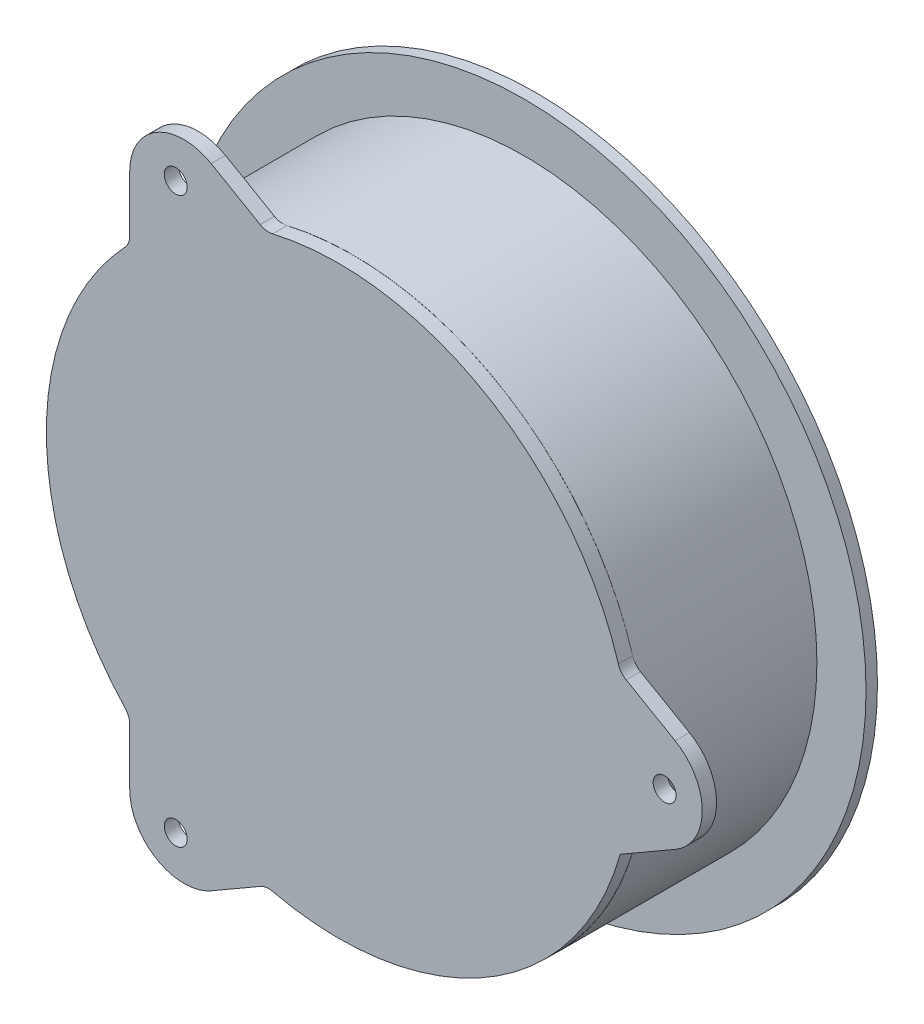
ISO-10303-21;
HEADER;
FILE_DESCRIPTION(('STEP AP214'),'2;1');
FILE_NAME('part.step','',(''),(''),'','','');
FILE_SCHEMA(('AUTOMOTIVE_DESIGN { 1 0 10303 214 1 1 1 1 }'));
ENDSEC;
DATA;
#1=APPLICATION_CONTEXT('core data for automotive mechanical design processes');
#2=APPLICATION_PROTOCOL_DEFINITION('international standard','automotive_design',2000,#1);
#3=PRODUCT_CONTEXT('',#1,'mechanical');
#4=PRODUCT('Part','Part','',(#3));
#5=PRODUCT_RELATED_PRODUCT_CATEGORY('part','',(#4));
#6=PRODUCT_DEFINITION_FORMATION('','',#4);
#7=PRODUCT_DEFINITION_CONTEXT('part definition',#1,'design');
#8=PRODUCT_DEFINITION('design','',#6,#7);
#9=PRODUCT_DEFINITION_SHAPE('','',#8);
#10=(LENGTH_UNIT() NAMED_UNIT(*) SI_UNIT(.MILLI.,.METRE.));
#11=(NAMED_UNIT(*) PLANE_ANGLE_UNIT() SI_UNIT($,.RADIAN.));
#12=(NAMED_UNIT(*) SI_UNIT($,.STERADIAN.) SOLID_ANGLE_UNIT());
#13=UNCERTAINTY_MEASURE_WITH_UNIT(LENGTH_MEASURE(1.E-05),#10,'distance_accuracy_value','');
#14=(GEOMETRIC_REPRESENTATION_CONTEXT(3) GLOBAL_UNCERTAINTY_ASSIGNED_CONTEXT((#13)) GLOBAL_UNIT_ASSIGNED_CONTEXT((#10,
#11,#12)) REPRESENTATION_CONTEXT('',''));
#15=CARTESIAN_POINT('',(0.,0.,0.));
#16=DIRECTION('',(0.,0.,1.));
#17=DIRECTION('',(1.,0.,0.));
#18=AXIS2_PLACEMENT_3D('',#15,#16,#17);
#19=CARTESIAN_POINT('',(0.,0.,81.28));
#20=DIRECTION('',(0.,0.,1.));
#21=DIRECTION('',(1.,0.,0.));
#22=AXIS2_PLACEMENT_3D('',#19,#20,#21);
#23=PLANE('',#22);
#24=CARTESIAN_POINT('',(-100.489363805133,-93.9319833695154,81.28));
#25=DIRECTION('',(0.,0.,-1.));
#26=DIRECTION('',(-1.,0.,0.));
#27=AXIS2_PLACEMENT_3D('',#24,#25,#26);
#28=CIRCLE('',#27,7.62000000000001);
#29=CARTESIAN_POINT('',(-94.9226455523167,-88.728518380322,81.28));
#30=VERTEX_POINT('',#29);
#31=CARTESIAN_POINT('',(-94.3081144996637,-89.4759136860797,81.28));
#32=VERTEX_POINT('',#31);
#33=EDGE_CURVE('E51',#30,#32,#28,.T.);
#34=ORIENTED_EDGE('',*,*,#33,.F.);
#35=CARTESIAN_POINT('',(0.,0.,81.28));
#36=DIRECTION('',(0.,0.,1.));
#37=DIRECTION('',(1.,0.,0.));
#38=AXIS2_PLACEMENT_3D('',#35,#36,#37);
#39=CIRCLE('',#38,129.934824479883);
#40=CARTESIAN_POINT('',(-94.9226455523159,88.7285183803229,81.28));
#41=VERTEX_POINT('',#40);
#42=EDGE_CURVE('E55',#41,#30,#39,.T.);
#43=ORIENTED_EDGE('',*,*,#42,.F.);
#44=CARTESIAN_POINT('',(-100.489363805132,93.9319833695163,81.28));
#45=DIRECTION('',(0.,0.,-1.));
#46=DIRECTION('',(1.,0.,0.));
#47=AXIS2_PLACEMENT_3D('',#44,#45,#46);
#48=CIRCLE('',#47,7.62);
#49=CARTESIAN_POINT('',(-94.3081144996605,89.4759136860832,81.28));
#50=VERTEX_POINT('',#49);
#51=EDGE_CURVE('E11',#50,#41,#48,.T.);
#52=ORIENTED_EDGE('',*,*,#51,.F.);
#53=CARTESIAN_POINT('',(0.,0.,81.28));
#54=DIRECTION('',(0.,0.,1.));
#55=DIRECTION('',(1.,0.,0.));
#56=AXIS2_PLACEMENT_3D('',#53,#54,#55);
#57=CIRCLE('',#56,129.999844578524);
#58=EDGE_CURVE('E717',#50,#32,#57,.T.);
#59=ORIENTED_EDGE('',*,*,#58,.T.);
#60=EDGE_LOOP('',(#34,#43,#52,#59));
#61=FACE_BOUND('',#60,.T.);
#62=ADVANCED_FACE('F33',(#61),#23,.T.);
#63=CARTESIAN_POINT('',(-31.1028019232913,133.992333550139,81.28));
#64=DIRECTION('',(0.,0.,-1.));
#65=DIRECTION('',(-1.,0.,0.));
#66=AXIS2_PLACEMENT_3D('',#63,#64,#65);
#67=CIRCLE('',#66,7.61999999999998);
#68=CARTESIAN_POINT('',(-29.3798281813551,126.569681632893,81.28));
#69=VERTEX_POINT('',#68);
#70=CARTESIAN_POINT('',(-30.334357029137,126.41117978276,81.28));
#71=VERTEX_POINT('',#70);
#72=EDGE_CURVE('E588',#69,#71,#67,.T.);
#73=ORIENTED_EDGE('',*,*,#72,.F.);
#74=CARTESIAN_POINT('',(0.,0.,81.28));
#75=DIRECTION('',(0.,0.,1.));
#76=DIRECTION('',(1.,0.,0.));
#77=AXIS2_PLACEMENT_3D('',#74,#75,#76);
#78=CIRCLE('',#77,129.934824479883);
#79=CARTESIAN_POINT('',(124.302473733672,37.8411632525701,81.28));
#80=VERTEX_POINT('',#79);
#81=EDGE_CURVE('E589',#80,#69,#78,.T.);
#82=ORIENTED_EDGE('',*,*,#81,.F.);
#83=CARTESIAN_POINT('',(131.592165728425,40.0603501806229,81.28));
#84=DIRECTION('',(0.,0.,-1.));
#85=DIRECTION('',(-1.,0.,0.));
#86=AXIS2_PLACEMENT_3D('',#83,#84,#85);
#87=CIRCLE('',#86,7.62000000000001);
#88=CARTESIAN_POINT('',(124.642471528801,36.9352660966795,81.28));
#89=VERTEX_POINT('',#88);
#90=EDGE_CURVE('E42',#89,#80,#87,.T.);
#91=ORIENTED_EDGE('',*,*,#90,.F.);
#92=EDGE_CURVE('E208',#89,#71,#57,.T.);
#93=ORIENTED_EDGE('',*,*,#92,.T.);
#94=EDGE_LOOP('',(#73,#82,#91,#93));
#95=FACE_BOUND('',#94,.T.);
#96=ADVANCED_FACE('F250',(#95),#23,.T.);
#97=CARTESIAN_POINT('',(0.,0.,5.08));
#98=DIRECTION('',(0.,0.,1.));
#99=DIRECTION('',(1.,0.,0.));
#100=AXIS2_PLACEMENT_3D('',#97,#98,#99);
#101=PLANE('',#100);
#102=CARTESIAN_POINT('',(0.,0.,5.08));
#103=DIRECTION('',(0.,0.,1.));
#104=DIRECTION('',(1.,0.,0.));
#105=AXIS2_PLACEMENT_3D('',#102,#103,#104);
#106=CIRCLE('',#105,151.840016694933);
#107=CARTESIAN_POINT('',(151.840016694933,0.,5.08));
#108=VERTEX_POINT('',#107);
#109=EDGE_CURVE('E220',#108,#108,#106,.T.);
#110=ORIENTED_EDGE('',*,*,#109,.T.);
#111=EDGE_LOOP('',(#110));
#112=FACE_BOUND('',#111,.T.);
#113=CARTESIAN_POINT('',(0.,0.,5.08));
#114=DIRECTION('',(0.,0.,1.));
#115=DIRECTION('',(1.,0.,0.));
#116=AXIS2_PLACEMENT_3D('',#113,#114,#115);
#117=CIRCLE('',#116,129.999844578524);
#118=CARTESIAN_POINT('',(129.999844578524,0.,5.08));
#119=VERTEX_POINT('',#118);
#120=EDGE_CURVE('E207',#119,#119,#117,.T.);
#121=ORIENTED_EDGE('',*,*,#120,.F.);
#122=EDGE_LOOP('',(#121));
#123=FACE_BOUND('',#122,.T.);
#124=ADVANCED_FACE('F235',(#112,#123),#101,.T.);
#125=CARTESIAN_POINT('',(0.,0.,0.));
#126=DIRECTION('',(0.,0.,1.));
#127=DIRECTION('',(1.,0.,0.));
#128=AXIS2_PLACEMENT_3D('',#125,#126,#127);
#129=PLANE('',#128);
#130=CARTESIAN_POINT('',(0.,0.,0.));
#131=DIRECTION('',(0.,0.,1.));
#132=DIRECTION('',(1.,0.,0.));
#133=AXIS2_PLACEMENT_3D('',#130,#131,#132);
#134=CIRCLE('',#133,151.840016694933);
#135=CARTESIAN_POINT('',(151.840016694933,0.,0.));
#136=VERTEX_POINT('',#135);
#137=EDGE_CURVE('E37',#136,#136,#134,.T.);
#138=ORIENTED_EDGE('',*,*,#137,.F.);
#139=EDGE_LOOP('',(#138));
#140=FACE_BOUND('',#139,.T.);
#141=CARTESIAN_POINT('',(0.,0.,0.));
#142=DIRECTION('',(0.,0.,1.));
#143=DIRECTION('',(1.,0.,0.));
#144=AXIS2_PLACEMENT_3D('',#141,#142,#143);
#145=CIRCLE('',#144,128.375867971405);
#146=CARTESIAN_POINT('',(128.375867971405,0.,0.));
#147=VERTEX_POINT('',#146);
#148=EDGE_CURVE('E218',#147,#147,#145,.T.);
#149=ORIENTED_EDGE('',*,*,#148,.T.);
#150=EDGE_LOOP('',(#149));
#151=FACE_BOUND('',#150,.T.);
#152=ADVANCED_FACE('F232',(#140,#151),#129,.F.);
#153=CARTESIAN_POINT('',(0.,0.,5.08));
#154=DIRECTION('',(0.,0.,-1.));
#155=DIRECTION('',(-1.,0.,0.));
#156=AXIS2_PLACEMENT_3D('',#153,#154,#155);
#157=CYLINDRICAL_SURFACE('',#156,151.840016694933);
#158=ORIENTED_EDGE('',*,*,#109,.F.);
#159=EDGE_LOOP('',(#158));
#160=FACE_BOUND('',#159,.T.);
#161=ORIENTED_EDGE('',*,*,#137,.T.);
#162=EDGE_LOOP('',(#161));
#163=FACE_BOUND('',#162,.T.);
#164=ADVANCED_FACE('F35',(#160,#163),#157,.T.);
#165=CARTESIAN_POINT('',(0.,0.,5.08));
#166=DIRECTION('',(0.,0.,-1.));
#167=DIRECTION('',(-1.,0.,0.));
#168=AXIS2_PLACEMENT_3D('',#165,#166,#167);
#169=CYLINDRICAL_SURFACE('',#168,128.375867971405);
#170=CARTESIAN_POINT('',(0.,0.,5.08));
#171=DIRECTION('',(0.,0.,1.));
#172=DIRECTION('',(1.,0.,0.));
#173=AXIS2_PLACEMENT_3D('',#170,#171,#172);
#174=CIRCLE('',#173,128.375867971405);
#175=CARTESIAN_POINT('',(128.375867971405,0.,5.08));
#176=VERTEX_POINT('',#175);
#177=EDGE_CURVE('E211',#176,#176,#174,.T.);
#178=ORIENTED_EDGE('',*,*,#177,.T.);
#179=EDGE_LOOP('',(#178));
#180=FACE_BOUND('',#179,.T.);
#181=ORIENTED_EDGE('',*,*,#148,.F.);
#182=EDGE_LOOP('',(#181));
#183=FACE_BOUND('',#182,.T.);
#184=ADVANCED_FACE('F238',(#180,#183),#169,.F.);
#185=DIRECTION('',(0.86602540378444,0.499999999999997,0.));
#186=VECTOR('',#185,1.);
#187=CARTESIAN_POINT('',(125.135094285767,-34.9895240137689,81.28));
#188=LINE('',#187,#186);
#189=CARTESIAN_POINT('',(125.135094285767,-34.989524013769,81.28));
#190=VERTEX_POINT('',#189);
#191=CARTESIAN_POINT('',(125.21558468143,-34.9430528621656,81.28));
#192=VERTEX_POINT('',#191);
#193=EDGE_CURVE('E664',#190,#192,#188,.T.);
#194=ORIENTED_EDGE('',*,*,#193,.F.);
#195=CARTESIAN_POINT('',(0.,0.,81.28));
#196=DIRECTION('',(0.,0.,1.));
#197=DIRECTION('',(1.,0.,0.));
#198=AXIS2_PLACEMENT_3D('',#195,#196,#197);
#199=CIRCLE('',#198,129.934824479883);
#200=CARTESIAN_POINT('',(-29.379828181356,-126.569681632893,81.28));
#201=VERTEX_POINT('',#200);
#202=EDGE_CURVE('E656',#201,#190,#199,.T.);
#203=ORIENTED_EDGE('',*,*,#202,.F.);
#204=CARTESIAN_POINT('',(-31.1028019232922,-133.992333550139,81.28));
#205=DIRECTION('',(0.,0.,-1.));
#206=DIRECTION('',(1.,0.,0.));
#207=AXIS2_PLACEMENT_3D('',#204,#205,#206);
#208=CIRCLE('',#207,7.62000000000004);
#209=CARTESIAN_POINT('',(-30.3343570291378,-126.41117978276,81.28));
#210=VERTEX_POINT('',#209);
#211=EDGE_CURVE('E222',#210,#201,#208,.T.);
#212=ORIENTED_EDGE('',*,*,#211,.F.);
#213=EDGE_CURVE('E715',#210,#192,#57,.T.);
#214=ORIENTED_EDGE('',*,*,#213,.T.);
#215=EDGE_LOOP('',(#194,#203,#212,#214));
#216=FACE_BOUND('',#215,.T.);
#217=ADVANCED_FACE('F240',(#216),#23,.T.);
#218=CARTESIAN_POINT('',(0.,0.,5.08));
#219=DIRECTION('',(0.,0.,1.));
#220=DIRECTION('',(1.,0.,0.));
#221=AXIS2_PLACEMENT_3D('',#218,#219,#220);
#222=PLANE('',#221);
#223=ORIENTED_EDGE('',*,*,#177,.F.);
#224=EDGE_LOOP('',(#223));
#225=FACE_BOUND('',#224,.T.);
#226=CARTESIAN_POINT('',(0.,0.,5.08));
#227=DIRECTION('',(0.,0.,1.));
#228=DIRECTION('',(1.,0.,0.));
#229=AXIS2_PLACEMENT_3D('',#226,#227,#228);
#230=CIRCLE('',#229,124.854824479883);
#231=CARTESIAN_POINT('',(-124.854824479883,0.,5.08));
#232=VERTEX_POINT('',#231);
#233=EDGE_CURVE('E199',#232,#232,#230,.T.);
#234=ORIENTED_EDGE('',*,*,#233,.T.);
#235=EDGE_LOOP('',(#234));
#236=FACE_BOUND('',#235,.T.);
#237=ADVANCED_FACE('F247',(#225,#236),#222,.F.);
#238=CARTESIAN_POINT('',(0.,0.,81.28));
#239=DIRECTION('',(0.,0.,-1.));
#240=DIRECTION('',(-1.,0.,0.));
#241=AXIS2_PLACEMENT_3D('',#238,#239,#240);
#242=CYLINDRICAL_SURFACE('',#241,129.999844578524);
#243=ORIENTED_EDGE('',*,*,#92,.F.);
#244=EDGE_CURVE('E213',#192,#89,#57,.T.);
#245=ORIENTED_EDGE('',*,*,#244,.F.);
#246=ORIENTED_EDGE('',*,*,#213,.F.);
#247=EDGE_CURVE('E716',#32,#210,#57,.T.);
#248=ORIENTED_EDGE('',*,*,#247,.F.);
#249=ORIENTED_EDGE('',*,*,#58,.F.);
#250=EDGE_CURVE('E212',#71,#50,#57,.T.);
#251=ORIENTED_EDGE('',*,*,#250,.F.);
#252=EDGE_LOOP('',(#243,#245,#246,#248,#249,#251));
#253=FACE_BOUND('',#252,.T.);
#254=ORIENTED_EDGE('',*,*,#120,.T.);
#255=EDGE_LOOP('',(#254));
#256=FACE_BOUND('',#255,.T.);
#257=ADVANCED_FACE('F264',(#253,#256),#242,.T.);
#258=CARTESIAN_POINT('',(0.,0.,81.28));
#259=DIRECTION('',(0.,0.,-1.));
#260=DIRECTION('',(-1.,0.,0.));
#261=AXIS2_PLACEMENT_3D('',#258,#259,#260);
#262=CYLINDRICAL_SURFACE('',#261,124.854824479883);
#263=CARTESIAN_POINT('',(0.,0.,81.28));
#264=DIRECTION('',(0.,0.,1.));
#265=DIRECTION('',(1.,0.,0.));
#266=AXIS2_PLACEMENT_3D('',#263,#264,#265);
#267=CIRCLE('',#266,124.854824479883);
#268=CARTESIAN_POINT('',(-124.854824479883,0.,81.28));
#269=VERTEX_POINT('',#268);
#270=EDGE_CURVE('E196',#269,#269,#267,.T.);
#271=CARTESIAN_POINT('',(-124.854824479883,0.,81.28));
#272=CARTESIAN_POINT('',(-124.854824479883,0.,80.48625));
#273=CARTESIAN_POINT('',(-124.854824479883,0.,79.6925));
#274=CARTESIAN_POINT('',(-124.854824479883,0.,78.105));
#275=CARTESIAN_POINT('',(-124.854824479883,0.,77.31125));
#276=CARTESIAN_POINT('',(-124.854824479883,0.,75.72375));
#277=CARTESIAN_POINT('',(-124.854824479883,0.,74.93));
#278=CARTESIAN_POINT('',(-124.854824479883,0.,73.3425));
#279=CARTESIAN_POINT('',(-124.854824479883,0.,72.54875));
#280=CARTESIAN_POINT('',(-124.854824479883,0.,70.96125));
#281=CARTESIAN_POINT('',(-124.854824479883,0.,70.1675));
#282=CARTESIAN_POINT('',(-124.854824479883,0.,68.58));
#283=CARTESIAN_POINT('',(-124.854824479883,0.,67.78625));
#284=CARTESIAN_POINT('',(-124.854824479883,0.,66.19875));
#285=CARTESIAN_POINT('',(-124.854824479883,0.,65.405));
#286=CARTESIAN_POINT('',(-124.854824479883,0.,63.8175));
#287=CARTESIAN_POINT('',(-124.854824479883,0.,63.02375));
#288=CARTESIAN_POINT('',(-124.854824479883,0.,61.43625));
#289=CARTESIAN_POINT('',(-124.854824479883,0.,60.6425));
#290=CARTESIAN_POINT('',(-124.854824479883,0.,59.055));
#291=CARTESIAN_POINT('',(-124.854824479883,0.,58.26125));
#292=CARTESIAN_POINT('',(-124.854824479883,0.,56.67375));
#293=CARTESIAN_POINT('',(-124.854824479883,0.,55.88));
#294=CARTESIAN_POINT('',(-124.854824479883,0.,54.2925));
#295=CARTESIAN_POINT('',(-124.854824479883,0.,53.49875));
#296=CARTESIAN_POINT('',(-124.854824479883,0.,51.91125));
#297=CARTESIAN_POINT('',(-124.854824479883,0.,51.1175));
#298=CARTESIAN_POINT('',(-124.854824479883,0.,49.53));
#299=CARTESIAN_POINT('',(-124.854824479883,0.,48.73625));
#300=CARTESIAN_POINT('',(-124.854824479883,0.,47.14875));
#301=CARTESIAN_POINT('',(-124.854824479883,0.,46.355));
#302=CARTESIAN_POINT('',(-124.854824479883,0.,44.7675));
#303=CARTESIAN_POINT('',(-124.854824479883,0.,43.97375));
#304=CARTESIAN_POINT('',(-124.854824479883,0.,42.38625));
#305=CARTESIAN_POINT('',(-124.854824479883,0.,41.5925));
#306=CARTESIAN_POINT('',(-124.854824479883,0.,40.005));
#307=CARTESIAN_POINT('',(-124.854824479883,0.,39.21125));
#308=CARTESIAN_POINT('',(-124.854824479883,0.,37.62375));
#309=CARTESIAN_POINT('',(-124.854824479883,0.,36.83));
#310=CARTESIAN_POINT('',(-124.854824479883,0.,35.2425));
#311=CARTESIAN_POINT('',(-124.854824479883,0.,34.44875));
#312=CARTESIAN_POINT('',(-124.854824479883,0.,32.86125));
#313=CARTESIAN_POINT('',(-124.854824479883,0.,32.0675));
#314=CARTESIAN_POINT('',(-124.854824479883,0.,30.48));
#315=CARTESIAN_POINT('',(-124.854824479883,0.,29.68625));
#316=CARTESIAN_POINT('',(-124.854824479883,0.,28.09875));
#317=CARTESIAN_POINT('',(-124.854824479883,0.,27.305));
#318=CARTESIAN_POINT('',(-124.854824479883,0.,25.7175));
#319=CARTESIAN_POINT('',(-124.854824479883,0.,24.92375));
#320=CARTESIAN_POINT('',(-124.854824479883,0.,23.33625));
#321=CARTESIAN_POINT('',(-124.854824479883,0.,22.5425));
#322=CARTESIAN_POINT('',(-124.854824479883,0.,20.955));
#323=CARTESIAN_POINT('',(-124.854824479883,0.,20.16125));
#324=CARTESIAN_POINT('',(-124.854824479883,0.,18.57375));
#325=CARTESIAN_POINT('',(-124.854824479883,0.,17.78));
#326=CARTESIAN_POINT('',(-124.854824479883,0.,16.1925));
#327=CARTESIAN_POINT('',(-124.854824479883,0.,15.39875));
#328=CARTESIAN_POINT('',(-124.854824479883,0.,13.81125));
#329=CARTESIAN_POINT('',(-124.854824479883,0.,13.0175));
#330=CARTESIAN_POINT('',(-124.854824479883,0.,11.43));
#331=CARTESIAN_POINT('',(-124.854824479883,0.,10.63625));
#332=CARTESIAN_POINT('',(-124.854824479883,0.,9.04875));
#333=CARTESIAN_POINT('',(-124.854824479883,0.,8.255));
#334=CARTESIAN_POINT('',(-124.854824479883,0.,6.6675));
#335=CARTESIAN_POINT('',(-124.854824479883,0.,5.87375));
#336=CARTESIAN_POINT('',(-124.854824479883,0.,5.08));
#337=B_SPLINE_CURVE_WITH_KNOTS('',3,(#271,#272,#273,#274,#275,#276,#277,#278,#279,#280,#281,
#282,#283,#284,#285,#286,#287,#288,#289,#290,#291,#292,#293,#294,#295,#296,#297,#298,#299,#300,
#301,#302,#303,#304,#305,#306,#307,#308,#309,#310,#311,#312,#313,#314,#315,#316,#317,#318,#319,
#320,#321,#322,#323,#324,#325,#326,#327,#328,#329,#330,#331,#332,#333,#334,#335,#336),
.UNSPECIFIED.,.F.,.F.,(4,2,2,2,2,2,2,2,2,2,2,2,2,2,2,2,2,2,2,2,2,2,2,2,2,2,2,2,2,2,2,2,4),(0.,
2.38124999999999,4.76249999999999,7.14374999999999,9.52499999999999,11.90625,14.2875,16.66875,
19.05,21.43125,23.8125,26.19375,28.575,30.95625,33.3375,35.71875,38.1,40.48125,42.8625,45.24375,
47.625,50.00625,52.3875,54.76875,57.15,59.53125,61.9125,64.29375,66.675,69.05625,71.4375,
73.81875,76.2),.UNSPECIFIED.);
#338=EDGE_CURVE('BSEAM261',#269,#232,#337,.T.);
#339=ORIENTED_EDGE('',*,*,#270,.T.);
#340=ORIENTED_EDGE('',*,*,#233,.F.);
#341=ORIENTED_EDGE('',*,*,#338,.T.);
#342=ORIENTED_EDGE('',*,*,#338,.F.);
#343=EDGE_LOOP('',(#339,#341,#340,#342));
#344=FACE_BOUND('',#343,.T.);
#345=ADVANCED_FACE('F261',(#344),#262,.F.);
#346=CARTESIAN_POINT('',(-72.4328751025748,-125.457419815949,87.63));
#347=DIRECTION('',(0.,0.,-1.));
#348=DIRECTION('',(-1.,0.,0.));
#349=AXIS2_PLACEMENT_3D('',#346,#347,#348);
#350=CYLINDRICAL_SURFACE('',#349,5.09960974398003);
#351=CARTESIAN_POINT('',(-72.4328751025748,-125.457419815949,87.63));
#352=DIRECTION('',(0.,0.,1.));
#353=DIRECTION('',(1.,0.,0.));
#354=AXIS2_PLACEMENT_3D('',#351,#352,#353);
#355=CIRCLE('',#354,5.09960974398003);
#356=CARTESIAN_POINT('',(-67.3332653585948,-125.457419815949,87.63));
#357=VERTEX_POINT('',#356);
#358=EDGE_CURVE('E738',#357,#357,#355,.T.);
#359=ORIENTED_EDGE('',*,*,#358,.T.);
#360=EDGE_LOOP('',(#359));
#361=FACE_BOUND('',#360,.T.);
#362=CARTESIAN_POINT('',(-72.4328751025748,-125.457419815949,81.28));
#363=DIRECTION('',(0.,0.,1.));
#364=DIRECTION('',(1.,0.,0.));
#365=AXIS2_PLACEMENT_3D('',#362,#363,#364);
#366=CIRCLE('',#365,5.09960974398003);
#367=CARTESIAN_POINT('',(-67.3332653585948,-125.457419815949,81.28));
#368=VERTEX_POINT('',#367);
#369=EDGE_CURVE('E741',#368,#368,#366,.T.);
#370=ORIENTED_EDGE('',*,*,#369,.F.);
#371=EDGE_LOOP('',(#370));
#372=FACE_BOUND('',#371,.T.);
#373=ADVANCED_FACE('F271',(#361,#372),#350,.F.);
#374=CARTESIAN_POINT('',(144.865750205149,0.,87.63));
#375=DIRECTION('',(0.,0.,-1.));
#376=DIRECTION('',(-1.,0.,0.));
#377=AXIS2_PLACEMENT_3D('',#374,#375,#376);
#378=CYLINDRICAL_SURFACE('',#377,5.09960974398004);
#379=CARTESIAN_POINT('',(144.865750205149,0.,87.63));
#380=DIRECTION('',(0.,0.,1.));
#381=DIRECTION('',(1.,0.,0.));
#382=AXIS2_PLACEMENT_3D('',#379,#380,#381);
#383=CIRCLE('',#382,5.09960974398004);
#384=CARTESIAN_POINT('',(149.965359949129,0.,87.63));
#385=VERTEX_POINT('',#384);
#386=EDGE_CURVE('E732',#385,#385,#383,.T.);
#387=ORIENTED_EDGE('',*,*,#386,.T.);
#388=EDGE_LOOP('',(#387));
#389=FACE_BOUND('',#388,.T.);
#390=CARTESIAN_POINT('',(144.865750205149,0.,81.28));
#391=DIRECTION('',(0.,0.,1.));
#392=DIRECTION('',(1.,0.,0.));
#393=AXIS2_PLACEMENT_3D('',#390,#391,#392);
#394=CIRCLE('',#393,5.09960974398004);
#395=CARTESIAN_POINT('',(149.965359949129,0.,81.28));
#396=VERTEX_POINT('',#395);
#397=EDGE_CURVE('E735',#396,#396,#394,.T.);
#398=ORIENTED_EDGE('',*,*,#397,.F.);
#399=EDGE_LOOP('',(#398));
#400=FACE_BOUND('',#399,.T.);
#401=ADVANCED_FACE('F334',(#389,#400),#378,.F.);
#402=CARTESIAN_POINT('',(-72.432875102575,125.457419815949,87.63));
#403=DIRECTION('',(0.,0.,-1.));
#404=DIRECTION('',(-1.,0.,0.));
#405=AXIS2_PLACEMENT_3D('',#402,#403,#404);
#406=CYLINDRICAL_SURFACE('',#405,5.09960974398003);
#407=CARTESIAN_POINT('',(-72.432875102575,125.457419815949,87.63));
#408=DIRECTION('',(0.,0.,1.));
#409=DIRECTION('',(1.,0.,0.));
#410=AXIS2_PLACEMENT_3D('',#407,#408,#409);
#411=CIRCLE('',#410,5.09960974398003);
#412=CARTESIAN_POINT('',(-67.333265358595,125.457419815949,87.63));
#413=VERTEX_POINT('',#412);
#414=EDGE_CURVE('E719',#413,#413,#411,.T.);
#415=ORIENTED_EDGE('',*,*,#414,.T.);
#416=EDGE_LOOP('',(#415));
#417=FACE_BOUND('',#416,.T.);
#418=CARTESIAN_POINT('',(-72.432875102575,125.457419815949,81.28));
#419=DIRECTION('',(0.,0.,1.));
#420=DIRECTION('',(1.,0.,0.));
#421=AXIS2_PLACEMENT_3D('',#418,#419,#420);
#422=CIRCLE('',#421,5.09960974398003);
#423=CARTESIAN_POINT('',(-67.333265358595,125.457419815949,81.28));
#424=VERTEX_POINT('',#423);
#425=EDGE_CURVE('E576',#424,#424,#422,.T.);
#426=ORIENTED_EDGE('',*,*,#425,.F.);
#427=EDGE_LOOP('',(#426));
#428=FACE_BOUND('',#427,.T.);
#429=ADVANCED_FACE('F343',(#417,#428),#406,.F.);
#430=CARTESIAN_POINT('',(0.,0.,87.63));
#431=DIRECTION('',(0.,0.,-1.));
#432=DIRECTION('',(-1.,0.,0.));
#433=AXIS2_PLACEMENT_3D('',#430,#431,#432);
#434=CYLINDRICAL_SURFACE('',#433,129.934824479883);
#435=ORIENTED_EDGE('',*,*,#42,.T.);
#436=DIRECTION('',(0.,0.,-1.));
#437=VECTOR('',#436,1.);
#438=CARTESIAN_POINT('',(-94.9226455523167,-88.728518380322,87.63));
#439=LINE('',#438,#437);
#440=CARTESIAN_POINT('',(-94.9226455523167,-88.728518380322,87.63));
#441=VERTEX_POINT('',#440);
#442=EDGE_CURVE('E605',#441,#30,#439,.T.);
#443=ORIENTED_EDGE('',*,*,#442,.F.);
#444=CARTESIAN_POINT('',(0.,0.,87.63));
#445=DIRECTION('',(0.,0.,1.));
#446=DIRECTION('',(1.,0.,0.));
#447=AXIS2_PLACEMENT_3D('',#444,#445,#446);
#448=CIRCLE('',#447,129.934824479883);
#449=CARTESIAN_POINT('',(-94.9226455523159,88.7285183803229,87.63));
#450=VERTEX_POINT('',#449);
#451=EDGE_CURVE('E187',#450,#441,#448,.T.);
#452=ORIENTED_EDGE('',*,*,#451,.F.);
#453=DIRECTION('',(0.,0.,-1.));
#454=VECTOR('',#453,1.);
#455=CARTESIAN_POINT('',(-94.9226455523159,88.7285183803229,87.63));
#456=LINE('',#455,#454);
#457=EDGE_CURVE('E607',#450,#41,#456,.T.);
#458=ORIENTED_EDGE('',*,*,#457,.T.);
#459=EDGE_LOOP('',(#435,#443,#452,#458));
#460=FACE_BOUND('',#459,.T.);
#461=ADVANCED_FACE('F352',(#460),#434,.T.);
#462=CARTESIAN_POINT('',(-100.489363805132,93.9319833695163,87.63));
#463=DIRECTION('',(0.,0.,-1.));
#464=DIRECTION('',(-1.,0.,0.));
#465=AXIS2_PLACEMENT_3D('',#462,#463,#464);
#466=CYLINDRICAL_SURFACE('',#465,7.62);
#467=CARTESIAN_POINT('',(-92.8693638051322,93.9319833695162,81.28));
#468=VERTEX_POINT('',#467);
#469=EDGE_CURVE('E44',#468,#50,#48,.T.);
#470=ORIENTED_EDGE('',*,*,#469,.T.);
#471=ORIENTED_EDGE('',*,*,#51,.T.);
#472=ORIENTED_EDGE('',*,*,#457,.F.);
#473=CARTESIAN_POINT('',(-100.489363805132,93.9319833695163,87.63));
#474=DIRECTION('',(0.,0.,-1.));
#475=DIRECTION('',(1.,0.,0.));
#476=AXIS2_PLACEMENT_3D('',#473,#474,#475);
#477=CIRCLE('',#476,7.62);
#478=CARTESIAN_POINT('',(-92.8693638051322,93.9319833695162,87.63));
#479=VERTEX_POINT('',#478);
#480=EDGE_CURVE('E692',#479,#450,#477,.T.);
#481=ORIENTED_EDGE('',*,*,#480,.F.);
#482=DIRECTION('',(0.,0.,-1.));
#483=VECTOR('',#482,1.);
#484=CARTESIAN_POINT('',(-92.8693638051322,93.9319833695162,87.63));
#485=LINE('',#484,#483);
#486=EDGE_CURVE('E610',#479,#468,#485,.T.);
#487=ORIENTED_EDGE('',*,*,#486,.T.);
#488=EDGE_LOOP('',(#470,#471,#472,#481,#487));
#489=FACE_BOUND('',#488,.T.);
#490=ADVANCED_FACE('F361',(#489),#466,.F.);
#491=CARTESIAN_POINT('',(-92.8693638051325,119.060070590451,87.63));
#492=DIRECTION('',(1.,0.,0.));
#493=DIRECTION('',(0.,1.,0.));
#494=AXIS2_PLACEMENT_3D('',#491,#492,#493);
#495=PLANE('',#494);
#496=DIRECTION('',(0.,-1.,0.));
#497=VECTOR('',#496,1.);
#498=CARTESIAN_POINT('',(-92.8693638051325,119.060070590451,81.28));
#499=LINE('',#498,#497);
#500=CARTESIAN_POINT('',(-92.8693638051323,119.060070590451,81.28));
#501=VERTEX_POINT('',#500);
#502=EDGE_CURVE('E602',#501,#468,#499,.T.);
#503=ORIENTED_EDGE('',*,*,#502,.T.);
#504=ORIENTED_EDGE('',*,*,#486,.F.);
#505=DIRECTION('',(0.,-1.,0.));
#506=VECTOR('',#505,1.);
#507=CARTESIAN_POINT('',(-92.8693638051325,119.060070590451,87.63));
#508=LINE('',#507,#506);
#509=CARTESIAN_POINT('',(-92.8693638051323,119.060070590451,87.63));
#510=VERTEX_POINT('',#509);
#511=EDGE_CURVE('E690',#510,#479,#508,.T.);
#512=ORIENTED_EDGE('',*,*,#511,.F.);
#513=DIRECTION('',(0.,0.,-1.));
#514=VECTOR('',#513,1.);
#515=CARTESIAN_POINT('',(-92.8693638051323,119.060070590451,87.63));
#516=LINE('',#515,#514);
#517=EDGE_CURVE('E613',#510,#501,#516,.T.);
#518=ORIENTED_EDGE('',*,*,#517,.T.);
#519=EDGE_LOOP('',(#503,#504,#512,#518));
#520=FACE_BOUND('',#519,.T.);
#521=ADVANCED_FACE('F370',(#520),#495,.F.);
#522=CARTESIAN_POINT('',(-68.7393638051321,119.060070590451,87.63));
#523=DIRECTION('',(0.,0.,-1.));
#524=DIRECTION('',(-1.,0.,0.));
#525=AXIS2_PLACEMENT_3D('',#522,#523,#524);
#526=CYLINDRICAL_SURFACE('',#525,24.1300000000002);
#527=CARTESIAN_POINT('',(-68.7393638051321,119.060070590451,81.28));
#528=DIRECTION('',(0.,0.,1.));
#529=DIRECTION('',(1.,0.,0.));
#530=AXIS2_PLACEMENT_3D('',#527,#528,#529);
#531=CIRCLE('',#530,24.1300000000002);
#532=CARTESIAN_POINT('',(-56.674363805132,139.957263583769,81.28));
#533=VERTEX_POINT('',#532);
#534=EDGE_CURVE('E596',#533,#501,#531,.T.);
#535=ORIENTED_EDGE('',*,*,#534,.T.);
#536=ORIENTED_EDGE('',*,*,#517,.F.);
#537=CARTESIAN_POINT('',(-68.7393638051321,119.060070590451,87.63));
#538=DIRECTION('',(0.,0.,1.));
#539=DIRECTION('',(1.,0.,0.));
#540=AXIS2_PLACEMENT_3D('',#537,#538,#539);
#541=CIRCLE('',#540,24.1300000000002);
#542=CARTESIAN_POINT('',(-56.674363805132,139.957263583769,87.63));
#543=VERTEX_POINT('',#542);
#544=EDGE_CURVE('E688',#543,#510,#541,.T.);
#545=ORIENTED_EDGE('',*,*,#544,.F.);
#546=DIRECTION('',(0.,0.,-1.));
#547=VECTOR('',#546,1.);
#548=CARTESIAN_POINT('',(-56.674363805132,139.957263583769,87.63));
#549=LINE('',#548,#547);
#550=EDGE_CURVE('E616',#543,#533,#549,.T.);
#551=ORIENTED_EDGE('',*,*,#550,.T.);
#552=EDGE_LOOP('',(#535,#536,#545,#551));
#553=FACE_BOUND('',#552,.T.);
#554=ADVANCED_FACE('F379',(#553),#526,.T.);
#555=CARTESIAN_POINT('',(-34.9128019232913,127.393219973302,87.63));
#556=DIRECTION('',(-0.500000000000004,-0.866025403784436,0.));
#557=DIRECTION('',(0.866025403784436,-0.500000000000004,0.));
#558=AXIS2_PLACEMENT_3D('',#555,#556,#557);
#559=PLANE('',#558);
#560=DIRECTION('',(-0.866025403784436,0.500000000000004,0.));
#561=VECTOR('',#560,1.);
#562=CARTESIAN_POINT('',(-34.9128019232913,127.393219973302,81.28));
#563=LINE('',#562,#561);
#564=CARTESIAN_POINT('',(-34.9128019232913,127.393219973302,81.28));
#565=VERTEX_POINT('',#564);
#566=EDGE_CURVE('E585',#565,#533,#563,.T.);
#567=ORIENTED_EDGE('',*,*,#566,.T.);
#568=ORIENTED_EDGE('',*,*,#550,.F.);
#569=DIRECTION('',(-0.866025403784436,0.500000000000004,0.));
#570=VECTOR('',#569,1.);
#571=CARTESIAN_POINT('',(-34.9128019232913,127.393219973302,87.63));
#572=LINE('',#571,#570);
#573=CARTESIAN_POINT('',(-34.9128019232913,127.393219973302,87.63));
#574=VERTEX_POINT('',#573);
#575=EDGE_CURVE('E681',#574,#543,#572,.T.);
#576=ORIENTED_EDGE('',*,*,#575,.F.);
#577=DIRECTION('',(0.,0.,-1.));
#578=VECTOR('',#577,1.);
#579=CARTESIAN_POINT('',(-34.9128019232913,127.393219973302,87.63));
#580=LINE('',#579,#578);
#581=EDGE_CURVE('E619',#574,#565,#580,.T.);
#582=ORIENTED_EDGE('',*,*,#581,.T.);
#583=EDGE_LOOP('',(#567,#568,#576,#582));
#584=FACE_BOUND('',#583,.T.);
#585=ADVANCED_FACE('F388',(#584),#559,.F.);
#586=CARTESIAN_POINT('',(-31.1028019232913,133.992333550139,87.63));
#587=DIRECTION('',(0.,0.,-1.));
#588=DIRECTION('',(-1.,0.,0.));
#589=AXIS2_PLACEMENT_3D('',#586,#587,#588);
#590=CYLINDRICAL_SURFACE('',#589,7.61999999999998);
#591=ORIENTED_EDGE('',*,*,#72,.T.);
#592=EDGE_CURVE('E580',#71,#565,#67,.T.);
#593=ORIENTED_EDGE('',*,*,#592,.T.);
#594=ORIENTED_EDGE('',*,*,#581,.F.);
#595=CARTESIAN_POINT('',(-31.1028019232913,133.992333550139,87.63));
#596=DIRECTION('',(0.,0.,-1.));
#597=DIRECTION('',(-1.,0.,0.));
#598=AXIS2_PLACEMENT_3D('',#595,#596,#597);
#599=CIRCLE('',#598,7.61999999999998);
#600=CARTESIAN_POINT('',(-29.3798281813551,126.569681632893,87.63));
#601=VERTEX_POINT('',#600);
#602=EDGE_CURVE('E678',#601,#574,#599,.T.);
#603=ORIENTED_EDGE('',*,*,#602,.F.);
#604=DIRECTION('',(0.,0.,-1.));
#605=VECTOR('',#604,1.);
#606=CARTESIAN_POINT('',(-29.3798281813551,126.569681632893,87.63));
#607=LINE('',#606,#605);
#608=EDGE_CURVE('E594',#601,#69,#607,.T.);
#609=ORIENTED_EDGE('',*,*,#608,.T.);
#610=EDGE_LOOP('',(#591,#593,#594,#603,#609));
#611=FACE_BOUND('',#610,.T.);
#612=ADVANCED_FACE('F397',(#611),#590,.F.);
#613=CARTESIAN_POINT('',(0.,0.,87.63));
#614=DIRECTION('',(0.,0.,-1.));
#615=DIRECTION('',(-1.,0.,0.));
#616=AXIS2_PLACEMENT_3D('',#613,#614,#615);
#617=CYLINDRICAL_SURFACE('',#616,129.934824479883);
#618=ORIENTED_EDGE('',*,*,#81,.T.);
#619=ORIENTED_EDGE('',*,*,#608,.F.);
#620=CARTESIAN_POINT('',(0.,0.,87.63));
#621=DIRECTION('',(0.,0.,1.));
#622=DIRECTION('',(1.,0.,0.));
#623=AXIS2_PLACEMENT_3D('',#620,#621,#622);
#624=CIRCLE('',#623,129.934824479883);
#625=CARTESIAN_POINT('',(124.302473733672,37.8411632525701,87.63));
#626=VERTEX_POINT('',#625);
#627=EDGE_CURVE('E677',#626,#601,#624,.T.);
#628=ORIENTED_EDGE('',*,*,#627,.F.);
#629=DIRECTION('',(0.,0.,-1.));
#630=VECTOR('',#629,1.);
#631=CARTESIAN_POINT('',(124.302473733672,37.8411632525701,87.63));
#632=LINE('',#631,#630);
#633=EDGE_CURVE('E622',#626,#80,#632,.T.);
#634=ORIENTED_EDGE('',*,*,#633,.T.);
#635=EDGE_LOOP('',(#618,#619,#628,#634));
#636=FACE_BOUND('',#635,.T.);
#637=ADVANCED_FACE('F406',(#636),#617,.T.);
#638=CARTESIAN_POINT('',(131.592165728425,40.0603501806229,87.63));
#639=DIRECTION('',(0.,0.,-1.));
#640=DIRECTION('',(-1.,0.,0.));
#641=AXIS2_PLACEMENT_3D('',#638,#639,#640);
#642=CYLINDRICAL_SURFACE('',#641,7.62000000000001);
#643=CARTESIAN_POINT('',(127.782165728425,33.4612366037855,81.28));
#644=VERTEX_POINT('',#643);
#645=EDGE_CURVE('E670',#644,#89,#87,.T.);
#646=ORIENTED_EDGE('',*,*,#645,.T.);
#647=ORIENTED_EDGE('',*,*,#90,.T.);
#648=ORIENTED_EDGE('',*,*,#633,.F.);
#649=CARTESIAN_POINT('',(131.592165728425,40.0603501806229,87.63));
#650=DIRECTION('',(0.,0.,-1.));
#651=DIRECTION('',(-1.,0.,0.));
#652=AXIS2_PLACEMENT_3D('',#649,#650,#651);
#653=CIRCLE('',#652,7.62000000000001);
#654=CARTESIAN_POINT('',(127.782165728425,33.4612366037855,87.63));
#655=VERTEX_POINT('',#654);
#656=EDGE_CURVE('E679',#655,#626,#653,.T.);
#657=ORIENTED_EDGE('',*,*,#656,.F.);
#658=DIRECTION('',(0.,0.,-1.));
#659=VECTOR('',#658,1.);
#660=CARTESIAN_POINT('',(127.782165728425,33.4612366037855,87.63));
#661=LINE('',#660,#659);
#662=EDGE_CURVE('E625',#655,#644,#661,.T.);
#663=ORIENTED_EDGE('',*,*,#662,.T.);
#664=EDGE_LOOP('',(#646,#647,#648,#657,#663));
#665=FACE_BOUND('',#664,.T.);
#666=ADVANCED_FACE('F415',(#665),#642,.F.);
#667=CARTESIAN_POINT('',(149.543727610265,20.8971929933179,87.63));
#668=DIRECTION('',(-0.500000000000003,-0.866025403784437,0.));
#669=DIRECTION('',(0.866025403784437,-0.500000000000003,0.));
#670=AXIS2_PLACEMENT_3D('',#667,#668,#669);
#671=PLANE('',#670);
#672=DIRECTION('',(-0.866025403784437,0.500000000000003,0.));
#673=VECTOR('',#672,1.);
#674=CARTESIAN_POINT('',(149.543727610265,20.8971929933179,81.28));
#675=LINE('',#674,#673);
#676=CARTESIAN_POINT('',(149.543727610265,20.8971929933179,81.28));
#677=VERTEX_POINT('',#676);
#678=EDGE_CURVE('E669',#677,#644,#675,.T.);
#679=ORIENTED_EDGE('',*,*,#678,.T.);
#680=ORIENTED_EDGE('',*,*,#662,.F.);
#681=DIRECTION('',(-0.866025403784437,0.500000000000003,0.));
#682=VECTOR('',#681,1.);
#683=CARTESIAN_POINT('',(149.543727610265,20.8971929933179,87.63));
#684=LINE('',#683,#682);
#685=CARTESIAN_POINT('',(149.543727610265,20.8971929933179,87.63));
#686=VERTEX_POINT('',#685);
#687=EDGE_CURVE('E683',#686,#655,#684,.T.);
#688=ORIENTED_EDGE('',*,*,#687,.F.);
#689=DIRECTION('',(0.,0.,-1.));
#690=VECTOR('',#689,1.);
#691=CARTESIAN_POINT('',(149.543727610265,20.8971929933179,87.63));
#692=LINE('',#691,#690);
#693=EDGE_CURVE('E628',#686,#677,#692,.T.);
#694=ORIENTED_EDGE('',*,*,#693,.T.);
#695=EDGE_LOOP('',(#679,#680,#688,#694));
#696=FACE_BOUND('',#695,.T.);
#697=ADVANCED_FACE('F424',(#696),#671,.F.);
#698=CARTESIAN_POINT('',(137.478727610265,-5.60315682740509E-13,87.63));
#699=DIRECTION('',(0.,0.,-1.));
#700=DIRECTION('',(-1.,0.,0.));
#701=AXIS2_PLACEMENT_3D('',#698,#699,#700);
#702=CYLINDRICAL_SURFACE('',#701,24.13);
#703=CARTESIAN_POINT('',(137.478727610265,-5.60315682740509E-13,81.28));
#704=DIRECTION('',(0.,0.,1.));
#705=DIRECTION('',(1.,0.,0.));
#706=AXIS2_PLACEMENT_3D('',#703,#704,#705);
#707=CIRCLE('',#706,24.13);
#708=CARTESIAN_POINT('',(149.543727610265,-20.8971929933191,81.28));
#709=VERTEX_POINT('',#708);
#710=EDGE_CURVE('E667',#709,#677,#707,.T.);
#711=ORIENTED_EDGE('',*,*,#710,.T.);
#712=ORIENTED_EDGE('',*,*,#693,.F.);
#713=CARTESIAN_POINT('',(137.478727610265,-5.60315682740509E-13,87.63));
#714=DIRECTION('',(0.,0.,1.));
#715=DIRECTION('',(1.,0.,0.));
#716=AXIS2_PLACEMENT_3D('',#713,#714,#715);
#717=CIRCLE('',#716,24.13);
#718=CARTESIAN_POINT('',(149.543727610265,-20.8971929933191,87.63));
#719=VERTEX_POINT('',#718);
#720=EDGE_CURVE('E704',#719,#686,#717,.T.);
#721=ORIENTED_EDGE('',*,*,#720,.F.);
#722=DIRECTION('',(0.,0.,-1.));
#723=VECTOR('',#722,1.);
#724=CARTESIAN_POINT('',(149.543727610265,-20.8971929933191,87.63));
#725=LINE('',#724,#723);
#726=EDGE_CURVE('E631',#719,#709,#725,.T.);
#727=ORIENTED_EDGE('',*,*,#726,.T.);
#728=EDGE_LOOP('',(#711,#712,#721,#727));
#729=FACE_BOUND('',#728,.T.);
#730=ADVANCED_FACE('F433',(#729),#702,.T.);
#731=CARTESIAN_POINT('',(125.135094285767,-34.9895240137689,87.63));
#732=DIRECTION('',(-0.499999999999997,0.86602540378444,0.));
#733=DIRECTION('',(-0.86602540378444,-0.499999999999997,0.));
#734=AXIS2_PLACEMENT_3D('',#731,#732,#733);
#735=PLANE('',#734);
#736=ORIENTED_EDGE('',*,*,#193,.T.);
#737=EDGE_CURVE('E663',#192,#709,#188,.T.);
#738=ORIENTED_EDGE('',*,*,#737,.T.);
#739=ORIENTED_EDGE('',*,*,#726,.F.);
#740=DIRECTION('',(0.86602540378444,0.499999999999997,0.));
#741=VECTOR('',#740,1.);
#742=CARTESIAN_POINT('',(125.135094285767,-34.9895240137689,87.63));
#743=LINE('',#742,#741);
#744=CARTESIAN_POINT('',(125.135094285767,-34.989524013769,87.63));
#745=VERTEX_POINT('',#744);
#746=EDGE_CURVE('E702',#745,#719,#743,.T.);
#747=ORIENTED_EDGE('',*,*,#746,.F.);
#748=DIRECTION('',(0.,0.,-1.));
#749=VECTOR('',#748,1.);
#750=CARTESIAN_POINT('',(125.135094285767,-34.989524013769,87.63));
#751=LINE('',#750,#749);
#752=EDGE_CURVE('E634',#745,#190,#751,.T.);
#753=ORIENTED_EDGE('',*,*,#752,.T.);
#754=EDGE_LOOP('',(#736,#738,#739,#747,#753));
#755=FACE_BOUND('',#754,.T.);
#756=ADVANCED_FACE('F442',(#755),#735,.F.);
#757=CARTESIAN_POINT('',(0.,0.,87.63));
#758=DIRECTION('',(0.,0.,-1.));
#759=DIRECTION('',(-1.,0.,0.));
#760=AXIS2_PLACEMENT_3D('',#757,#758,#759);
#761=CYLINDRICAL_SURFACE('',#760,129.934824479883);
#762=ORIENTED_EDGE('',*,*,#202,.T.);
#763=ORIENTED_EDGE('',*,*,#752,.F.);
#764=CARTESIAN_POINT('',(0.,0.,87.63));
#765=DIRECTION('',(0.,0.,1.));
#766=DIRECTION('',(1.,0.,0.));
#767=AXIS2_PLACEMENT_3D('',#764,#765,#766);
#768=CIRCLE('',#767,129.934824479883);
#769=CARTESIAN_POINT('',(-29.379828181356,-126.569681632893,87.63));
#770=VERTEX_POINT('',#769);
#771=EDGE_CURVE('E700',#770,#745,#768,.T.);
#772=ORIENTED_EDGE('',*,*,#771,.F.);
#773=DIRECTION('',(0.,0.,-1.));
#774=VECTOR('',#773,1.);
#775=CARTESIAN_POINT('',(-29.379828181356,-126.569681632893,87.63));
#776=LINE('',#775,#774);
#777=EDGE_CURVE('E637',#770,#201,#776,.T.);
#778=ORIENTED_EDGE('',*,*,#777,.T.);
#779=EDGE_LOOP('',(#762,#763,#772,#778));
#780=FACE_BOUND('',#779,.T.);
#781=ADVANCED_FACE('F451',(#780),#761,.T.);
#782=CARTESIAN_POINT('',(-31.1028019232922,-133.992333550139,87.63));
#783=DIRECTION('',(0.,0.,-1.));
#784=DIRECTION('',(-1.,0.,0.));
#785=AXIS2_PLACEMENT_3D('',#782,#783,#784);
#786=CYLINDRICAL_SURFACE('',#785,7.62000000000004);
#787=CARTESIAN_POINT('',(-34.9128019232922,-127.393219973302,81.28));
#788=VERTEX_POINT('',#787);
#789=EDGE_CURVE('E227',#788,#210,#208,.T.);
#790=ORIENTED_EDGE('',*,*,#789,.T.);
#791=ORIENTED_EDGE('',*,*,#211,.T.);
#792=ORIENTED_EDGE('',*,*,#777,.F.);
#793=CARTESIAN_POINT('',(-31.1028019232922,-133.992333550139,87.63));
#794=DIRECTION('',(0.,0.,-1.));
#795=DIRECTION('',(1.,0.,0.));
#796=AXIS2_PLACEMENT_3D('',#793,#794,#795);
#797=CIRCLE('',#796,7.62000000000004);
#798=CARTESIAN_POINT('',(-34.9128019232922,-127.393219973302,87.63));
#799=VERTEX_POINT('',#798);
#800=EDGE_CURVE('E696',#799,#770,#797,.T.);
#801=ORIENTED_EDGE('',*,*,#800,.F.);
#802=DIRECTION('',(0.,0.,-1.));
#803=VECTOR('',#802,1.);
#804=CARTESIAN_POINT('',(-34.9128019232922,-127.393219973302,87.63));
#805=LINE('',#804,#803);
#806=EDGE_CURVE('E640',#799,#788,#805,.T.);
#807=ORIENTED_EDGE('',*,*,#806,.T.);
#808=EDGE_LOOP('',(#790,#791,#792,#801,#807));
#809=FACE_BOUND('',#808,.T.);
#810=ADVANCED_FACE('F460',(#809),#786,.F.);
#811=CARTESIAN_POINT('',(-56.6743638051332,-139.957263583769,87.63));
#812=DIRECTION('',(-0.499999999999996,0.866025403784441,0.));
#813=DIRECTION('',(-0.866025403784441,-0.499999999999996,0.));
#814=AXIS2_PLACEMENT_3D('',#811,#812,#813);
#815=PLANE('',#814);
#816=DIRECTION('',(0.866025403784441,0.499999999999996,0.));
#817=VECTOR('',#816,1.);
#818=CARTESIAN_POINT('',(-56.6743638051332,-139.957263583769,81.28));
#819=LINE('',#818,#817);
#820=CARTESIAN_POINT('',(-56.6743638051332,-139.957263583769,81.28));
#821=VERTEX_POINT('',#820);
#822=EDGE_CURVE('E647',#821,#788,#819,.T.);
#823=ORIENTED_EDGE('',*,*,#822,.T.);
#824=ORIENTED_EDGE('',*,*,#806,.F.);
#825=DIRECTION('',(0.866025403784441,0.499999999999996,0.));
#826=VECTOR('',#825,1.);
#827=CARTESIAN_POINT('',(-56.6743638051332,-139.957263583769,87.63));
#828=LINE('',#827,#826);
#829=CARTESIAN_POINT('',(-56.6743638051332,-139.957263583769,87.63));
#830=VERTEX_POINT('',#829);
#831=EDGE_CURVE('E648',#830,#799,#828,.T.);
#832=ORIENTED_EDGE('',*,*,#831,.F.);
#833=DIRECTION('',(0.,0.,-1.));
#834=VECTOR('',#833,1.);
#835=CARTESIAN_POINT('',(-56.6743638051332,-139.957263583769,87.63));
#836=LINE('',#835,#834);
#837=EDGE_CURVE('E201',#830,#821,#836,.T.);
#838=ORIENTED_EDGE('',*,*,#837,.T.);
#839=EDGE_LOOP('',(#823,#824,#832,#838));
#840=FACE_BOUND('',#839,.T.);
#841=ADVANCED_FACE('F469',(#840),#815,.F.);
#842=CARTESIAN_POINT('',(-68.7393638051331,-119.060070590451,87.63));
#843=DIRECTION('',(0.,0.,-1.));
#844=DIRECTION('',(-1.,0.,0.));
#845=AXIS2_PLACEMENT_3D('',#842,#843,#844);
#846=CYLINDRICAL_SURFACE('',#845,24.13);
#847=CARTESIAN_POINT('',(-68.7393638051331,-119.060070590451,81.28));
#848=DIRECTION('',(0.,0.,1.));
#849=DIRECTION('',(1.,0.,0.));
#850=AXIS2_PLACEMENT_3D('',#847,#848,#849);
#851=CIRCLE('',#850,24.13);
#852=CARTESIAN_POINT('',(-92.8693638051331,-119.06007059045,81.28));
#853=VERTEX_POINT('',#852);
#854=EDGE_CURVE('E652',#853,#821,#851,.T.);
#855=ORIENTED_EDGE('',*,*,#854,.T.);
#856=ORIENTED_EDGE('',*,*,#837,.F.);
#857=CARTESIAN_POINT('',(-68.7393638051331,-119.060070590451,87.63));
#858=DIRECTION('',(0.,0.,1.));
#859=DIRECTION('',(1.,0.,0.));
#860=AXIS2_PLACEMENT_3D('',#857,#858,#859);
#861=CIRCLE('',#860,24.13);
#862=CARTESIAN_POINT('',(-92.8693638051331,-119.06007059045,87.63));
#863=VERTEX_POINT('',#862);
#864=EDGE_CURVE('E180',#863,#830,#861,.T.);
#865=ORIENTED_EDGE('',*,*,#864,.F.);
#866=DIRECTION('',(0.,0.,-1.));
#867=VECTOR('',#866,1.);
#868=CARTESIAN_POINT('',(-92.8693638051331,-119.06007059045,87.63));
#869=LINE('',#868,#867);
#870=EDGE_CURVE('E177',#863,#853,#869,.T.);
#871=ORIENTED_EDGE('',*,*,#870,.T.);
#872=EDGE_LOOP('',(#855,#856,#865,#871));
#873=FACE_BOUND('',#872,.T.);
#874=ADVANCED_FACE('F478',(#873),#846,.T.);
#875=CARTESIAN_POINT('',(-92.869363805133,-93.9319833695155,87.63));
#876=DIRECTION('',(1.,0.,0.));
#877=DIRECTION('',(0.,1.,0.));
#878=AXIS2_PLACEMENT_3D('',#875,#876,#877);
#879=PLANE('',#878);
#880=DIRECTION('',(0.,-1.,0.));
#881=VECTOR('',#880,1.);
#882=CARTESIAN_POINT('',(-92.869363805133,-93.9319833695155,81.28));
#883=LINE('',#882,#881);
#884=CARTESIAN_POINT('',(-92.869363805133,-93.9319833695155,81.28));
#885=VERTEX_POINT('',#884);
#886=EDGE_CURVE('E657',#885,#853,#883,.T.);
#887=ORIENTED_EDGE('',*,*,#886,.T.);
#888=ORIENTED_EDGE('',*,*,#870,.F.);
#889=DIRECTION('',(0.,-1.,0.));
#890=VECTOR('',#889,1.);
#891=CARTESIAN_POINT('',(-92.869363805133,-93.9319833695155,87.63));
#892=LINE('',#891,#890);
#893=CARTESIAN_POINT('',(-92.869363805133,-93.9319833695155,87.63));
#894=VERTEX_POINT('',#893);
#895=EDGE_CURVE('E171',#894,#863,#892,.T.);
#896=ORIENTED_EDGE('',*,*,#895,.F.);
#897=DIRECTION('',(0.,0.,-1.));
#898=VECTOR('',#897,1.);
#899=CARTESIAN_POINT('',(-92.869363805133,-93.9319833695155,87.63));
#900=LINE('',#899,#898);
#901=EDGE_CURVE('E175',#894,#885,#900,.T.);
#902=ORIENTED_EDGE('',*,*,#901,.T.);
#903=EDGE_LOOP('',(#887,#888,#896,#902));
#904=FACE_BOUND('',#903,.T.);
#905=ADVANCED_FACE('F173',(#904),#879,.F.);
#906=CARTESIAN_POINT('',(-100.489363805133,-93.9319833695154,87.63));
#907=DIRECTION('',(0.,0.,-1.));
#908=DIRECTION('',(-1.,0.,0.));
#909=AXIS2_PLACEMENT_3D('',#906,#907,#908);
#910=CYLINDRICAL_SURFACE('',#909,7.62000000000001);
#911=ORIENTED_EDGE('',*,*,#33,.T.);
#912=EDGE_CURVE('E194',#32,#885,#28,.T.);
#913=ORIENTED_EDGE('',*,*,#912,.T.);
#914=ORIENTED_EDGE('',*,*,#901,.F.);
#915=CARTESIAN_POINT('',(-100.489363805133,-93.9319833695154,87.63));
#916=DIRECTION('',(0.,0.,-1.));
#917=DIRECTION('',(-1.,0.,0.));
#918=AXIS2_PLACEMENT_3D('',#915,#916,#917);
#919=CIRCLE('',#918,7.62000000000001);
#920=EDGE_CURVE('E181',#441,#894,#919,.T.);
#921=ORIENTED_EDGE('',*,*,#920,.F.);
#922=ORIENTED_EDGE('',*,*,#442,.T.);
#923=EDGE_LOOP('',(#911,#913,#914,#921,#922));
#924=FACE_BOUND('',#923,.T.);
#925=ADVANCED_FACE('F192',(#924),#910,.F.);
#926=CARTESIAN_POINT('',(-100.489363805133,-93.9319833695154,81.28));
#927=DIRECTION('',(0.,0.,-1.));
#928=DIRECTION('',(-1.,0.,0.));
#929=AXIS2_PLACEMENT_3D('',#926,#927,#928);
#930=PLANE('',#929);
#931=ORIENTED_EDGE('',*,*,#397,.T.);
#932=EDGE_LOOP('',(#931));
#933=FACE_BOUND('',#932,.T.);
#934=ORIENTED_EDGE('',*,*,#737,.F.);
#935=ORIENTED_EDGE('',*,*,#244,.T.);
#936=ORIENTED_EDGE('',*,*,#645,.F.);
#937=ORIENTED_EDGE('',*,*,#678,.F.);
#938=ORIENTED_EDGE('',*,*,#710,.F.);
#939=EDGE_LOOP('',(#934,#935,#936,#937,#938));
#940=FACE_BOUND('',#939,.T.);
#941=ADVANCED_FACE('F502',(#933,#940),#930,.T.);
#942=CARTESIAN_POINT('',(-100.489363805133,-93.9319833695154,87.63));
#943=DIRECTION('',(0.,0.,-1.));
#944=DIRECTION('',(-1.,0.,0.));
#945=AXIS2_PLACEMENT_3D('',#942,#943,#944);
#946=PLANE('',#945);
#947=ORIENTED_EDGE('',*,*,#386,.F.);
#948=EDGE_LOOP('',(#947));
#949=FACE_BOUND('',#948,.T.);
#950=ORIENTED_EDGE('',*,*,#920,.T.);
#951=ORIENTED_EDGE('',*,*,#895,.T.);
#952=ORIENTED_EDGE('',*,*,#864,.T.);
#953=ORIENTED_EDGE('',*,*,#831,.T.);
#954=ORIENTED_EDGE('',*,*,#800,.T.);
#955=ORIENTED_EDGE('',*,*,#771,.T.);
#956=ORIENTED_EDGE('',*,*,#746,.T.);
#957=ORIENTED_EDGE('',*,*,#720,.T.);
#958=ORIENTED_EDGE('',*,*,#687,.T.);
#959=ORIENTED_EDGE('',*,*,#656,.T.);
#960=ORIENTED_EDGE('',*,*,#627,.T.);
#961=ORIENTED_EDGE('',*,*,#602,.T.);
#962=ORIENTED_EDGE('',*,*,#575,.T.);
#963=ORIENTED_EDGE('',*,*,#544,.T.);
#964=ORIENTED_EDGE('',*,*,#511,.T.);
#965=ORIENTED_EDGE('',*,*,#480,.T.);
#966=ORIENTED_EDGE('',*,*,#451,.T.);
#967=EDGE_LOOP('',(#950,#951,#952,#953,#954,#955,#956,#957,#958,#959,#960,#961,#962,#963,#964,
#965,#966));
#968=FACE_BOUND('',#967,.T.);
#969=ORIENTED_EDGE('',*,*,#414,.F.);
#970=EDGE_LOOP('',(#969));
#971=FACE_BOUND('',#970,.T.);
#972=ORIENTED_EDGE('',*,*,#358,.F.);
#973=EDGE_LOOP('',(#972));
#974=FACE_BOUND('',#973,.T.);
#975=ADVANCED_FACE('F184',(#949,#968,#971,#974),#946,.F.);
#976=ORIENTED_EDGE('',*,*,#369,.T.);
#977=EDGE_LOOP('',(#976));
#978=FACE_BOUND('',#977,.T.);
#979=ORIENTED_EDGE('',*,*,#912,.F.);
#980=ORIENTED_EDGE('',*,*,#247,.T.);
#981=ORIENTED_EDGE('',*,*,#789,.F.);
#982=ORIENTED_EDGE('',*,*,#822,.F.);
#983=ORIENTED_EDGE('',*,*,#854,.F.);
#984=ORIENTED_EDGE('',*,*,#886,.F.);
#985=EDGE_LOOP('',(#979,#980,#981,#982,#983,#984));
#986=FACE_BOUND('',#985,.T.);
#987=ADVANCED_FACE('F519',(#978,#986),#930,.T.);
#988=ORIENTED_EDGE('',*,*,#425,.T.);
#989=EDGE_LOOP('',(#988));
#990=FACE_BOUND('',#989,.T.);
#991=ORIENTED_EDGE('',*,*,#592,.F.);
#992=ORIENTED_EDGE('',*,*,#250,.T.);
#993=ORIENTED_EDGE('',*,*,#469,.F.);
#994=ORIENTED_EDGE('',*,*,#502,.F.);
#995=ORIENTED_EDGE('',*,*,#534,.F.);
#996=ORIENTED_EDGE('',*,*,#566,.F.);
#997=EDGE_LOOP('',(#991,#992,#993,#994,#995,#996));
#998=FACE_BOUND('',#997,.T.);
#999=ADVANCED_FACE('F511',(#990,#998),#930,.T.);
#1000=ORIENTED_EDGE('',*,*,#270,.F.);
#1001=EDGE_LOOP('',(#1000));
#1002=FACE_BOUND('',#1001,.T.);
#1003=ADVANCED_FACE('F512',(#1002),#930,.T.);
#1004=CLOSED_SHELL('',(#62,#96,#124,#152,#164,#184,#217,#237,#257,#345,#373,#401,#429,#461,#490,
#521,#554,#585,#612,#637,#666,#697,#730,#756,#781,#810,#841,#874,#905,#925,#941,#975,#987,#999,#1003));
#1005=MANIFOLD_SOLID_BREP('B2',#1004);
#1006=ADVANCED_BREP_SHAPE_REPRESENTATION('',(#18,#1005),#14);
#1007=SHAPE_DEFINITION_REPRESENTATION(#9,#1006);
ENDSEC;
END-ISO-10303-21;
